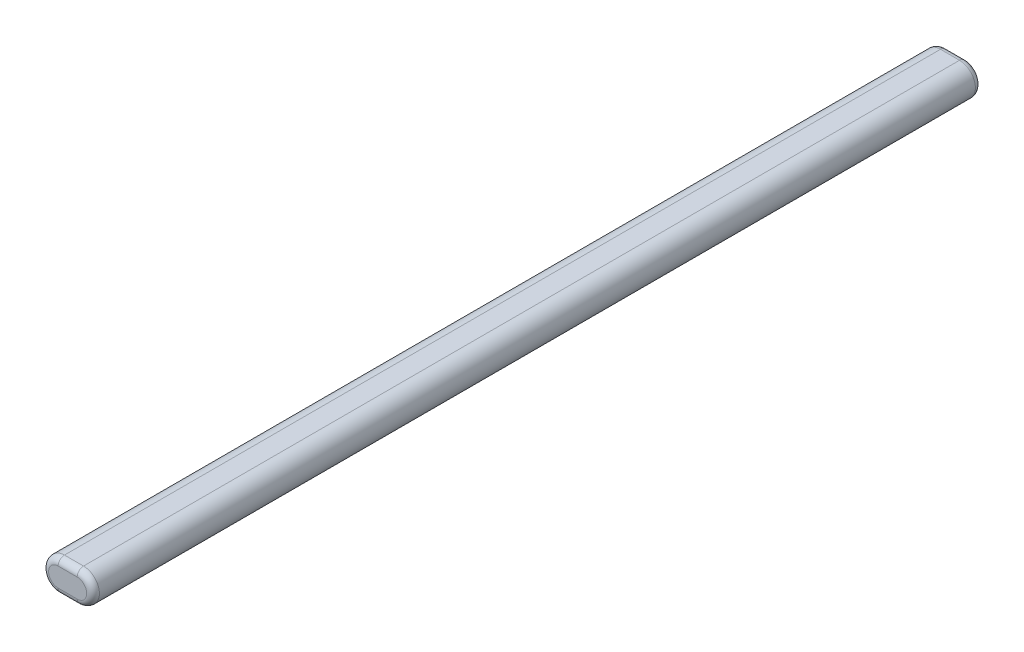
ISO-10303-21;
HEADER;
FILE_DESCRIPTION(('STEP AP214'),'2;1');
FILE_NAME('part.step','',(''),(''),'','','');
FILE_SCHEMA(('AUTOMOTIVE_DESIGN { 1 0 10303 214 1 1 1 1 }'));
ENDSEC;
DATA;
#1=APPLICATION_CONTEXT('core data for automotive mechanical design processes');
#2=APPLICATION_PROTOCOL_DEFINITION('international standard','automotive_design',2000,#1);
#3=PRODUCT_CONTEXT('',#1,'mechanical');
#4=PRODUCT('Part','Part','',(#3));
#5=PRODUCT_RELATED_PRODUCT_CATEGORY('part','',(#4));
#6=PRODUCT_DEFINITION_FORMATION('','',#4);
#7=PRODUCT_DEFINITION_CONTEXT('part definition',#1,'design');
#8=PRODUCT_DEFINITION('design','',#6,#7);
#9=PRODUCT_DEFINITION_SHAPE('','',#8);
#10=(LENGTH_UNIT() NAMED_UNIT(*) SI_UNIT(.MILLI.,.METRE.));
#11=(NAMED_UNIT(*) PLANE_ANGLE_UNIT() SI_UNIT($,.RADIAN.));
#12=(NAMED_UNIT(*) SI_UNIT($,.STERADIAN.) SOLID_ANGLE_UNIT());
#13=UNCERTAINTY_MEASURE_WITH_UNIT(LENGTH_MEASURE(1.E-05),#10,'distance_accuracy_value','');
#14=(GEOMETRIC_REPRESENTATION_CONTEXT(3) GLOBAL_UNCERTAINTY_ASSIGNED_CONTEXT((#13)) GLOBAL_UNIT_ASSIGNED_CONTEXT((#10,
#11,#12)) REPRESENTATION_CONTEXT('',''));
#15=CARTESIAN_POINT('',(0.,0.,0.));
#16=DIRECTION('',(0.,0.,1.));
#17=DIRECTION('',(1.,0.,0.));
#18=AXIS2_PLACEMENT_3D('',#15,#16,#17);
#19=CARTESIAN_POINT('',(-7.5,0.,700.));
#20=DIRECTION('',(0.,0.,-1.));
#21=DIRECTION('',(-1.,0.,0.));
#22=AXIS2_PLACEMENT_3D('',#19,#20,#21);
#23=CYLINDRICAL_SURFACE('',#22,12.5);
#24=DIRECTION('',(0.,0.,-1.));
#25=VECTOR('',#24,1.);
#26=CARTESIAN_POINT('',(-7.5,12.5,700.));
#27=LINE('',#26,#25);
#28=CARTESIAN_POINT('',(-7.5,12.5,695.));
#29=VERTEX_POINT('',#28);
#30=CARTESIAN_POINT('',(-7.5,12.5,5.));
#31=VERTEX_POINT('',#30);
#32=EDGE_CURVE('E155',#29,#31,#27,.T.);
#33=ORIENTED_EDGE('',*,*,#32,.T.);
#34=CARTESIAN_POINT('',(-7.5,0.,5.));
#35=DIRECTION('',(0.,0.,1.));
#36=DIRECTION('',(1.,0.,0.));
#37=AXIS2_PLACEMENT_3D('',#34,#35,#36);
#38=CIRCLE('',#37,12.5);
#39=CARTESIAN_POINT('',(-7.5,-12.5,5.));
#40=VERTEX_POINT('',#39);
#41=EDGE_CURVE('E179',#31,#40,#38,.T.);
#42=ORIENTED_EDGE('',*,*,#41,.T.);
#43=DIRECTION('',(0.,0.,-1.));
#44=VECTOR('',#43,1.);
#45=CARTESIAN_POINT('',(-7.5,-12.5,700.));
#46=LINE('',#45,#44);
#47=CARTESIAN_POINT('',(-7.5,-12.5,695.));
#48=VERTEX_POINT('',#47);
#49=EDGE_CURVE('E121',#48,#40,#46,.T.);
#50=ORIENTED_EDGE('',*,*,#49,.F.);
#51=CARTESIAN_POINT('',(-7.5,0.,695.));
#52=DIRECTION('',(0.,0.,1.));
#53=DIRECTION('',(1.,0.,0.));
#54=AXIS2_PLACEMENT_3D('',#51,#52,#53);
#55=CIRCLE('',#54,12.5);
#56=EDGE_CURVE('E177',#48,#29,#55,.F.);
#57=ORIENTED_EDGE('',*,*,#56,.T.);
#58=EDGE_LOOP('',(#33,#42,#50,#57));
#59=FACE_BOUND('',#58,.T.);
#60=ADVANCED_FACE('F33',(#59),#23,.T.);
#61=CARTESIAN_POINT('',(-7.5,-12.5,700.));
#62=DIRECTION('',(0.,1.,0.));
#63=DIRECTION('',(-1.,0.,0.));
#64=AXIS2_PLACEMENT_3D('',#61,#62,#63);
#65=PLANE('',#64);
#66=ORIENTED_EDGE('',*,*,#49,.T.);
#67=DIRECTION('',(1.,0.,0.));
#68=VECTOR('',#67,1.);
#69=CARTESIAN_POINT('',(-7.5,-12.5,5.));
#70=LINE('',#69,#68);
#71=CARTESIAN_POINT('',(7.49999999999999,-12.5,5.));
#72=VERTEX_POINT('',#71);
#73=EDGE_CURVE('E120',#40,#72,#70,.T.);
#74=ORIENTED_EDGE('',*,*,#73,.T.);
#75=DIRECTION('',(0.,0.,-1.));
#76=VECTOR('',#75,1.);
#77=CARTESIAN_POINT('',(7.49999999999999,-12.5,700.));
#78=LINE('',#77,#76);
#79=CARTESIAN_POINT('',(7.49999999999999,-12.5,695.));
#80=VERTEX_POINT('',#79);
#81=EDGE_CURVE('E102',#80,#72,#78,.T.);
#82=ORIENTED_EDGE('',*,*,#81,.F.);
#83=DIRECTION('',(1.,0.,0.));
#84=VECTOR('',#83,1.);
#85=CARTESIAN_POINT('',(-7.5,-12.5,695.));
#86=LINE('',#85,#84);
#87=EDGE_CURVE('E117',#80,#48,#86,.F.);
#88=ORIENTED_EDGE('',*,*,#87,.T.);
#89=EDGE_LOOP('',(#66,#74,#82,#88));
#90=FACE_BOUND('',#89,.T.);
#91=ADVANCED_FACE('F116',(#90),#65,.F.);
#92=CARTESIAN_POINT('',(7.5,0.,700.));
#93=DIRECTION('',(0.,0.,-1.));
#94=DIRECTION('',(-1.,0.,0.));
#95=AXIS2_PLACEMENT_3D('',#92,#93,#94);
#96=CYLINDRICAL_SURFACE('',#95,12.5);
#97=ORIENTED_EDGE('',*,*,#81,.T.);
#98=CARTESIAN_POINT('',(7.5,0.,5.));
#99=DIRECTION('',(0.,0.,1.));
#100=DIRECTION('',(1.,0.,0.));
#101=AXIS2_PLACEMENT_3D('',#98,#99,#100);
#102=CIRCLE('',#101,12.5);
#103=CARTESIAN_POINT('',(7.49999999999999,12.5,5.));
#104=VERTEX_POINT('',#103);
#105=EDGE_CURVE('E11',#72,#104,#102,.T.);
#106=ORIENTED_EDGE('',*,*,#105,.T.);
#107=DIRECTION('',(0.,0.,-1.));
#108=VECTOR('',#107,1.);
#109=CARTESIAN_POINT('',(7.49999999999999,12.5,700.));
#110=LINE('',#109,#108);
#111=CARTESIAN_POINT('',(7.49999999999999,12.5,695.));
#112=VERTEX_POINT('',#111);
#113=EDGE_CURVE('E104',#112,#104,#110,.T.);
#114=ORIENTED_EDGE('',*,*,#113,.F.);
#115=CARTESIAN_POINT('',(7.5,0.,695.));
#116=DIRECTION('',(0.,0.,1.));
#117=DIRECTION('',(1.,0.,0.));
#118=AXIS2_PLACEMENT_3D('',#115,#116,#117);
#119=CIRCLE('',#118,12.5);
#120=EDGE_CURVE('E42',#112,#80,#119,.F.);
#121=ORIENTED_EDGE('',*,*,#120,.T.);
#122=EDGE_LOOP('',(#97,#106,#114,#121));
#123=FACE_BOUND('',#122,.T.);
#124=ADVANCED_FACE('F101',(#123),#96,.T.);
#125=CARTESIAN_POINT('',(-7.5,12.5,700.));
#126=DIRECTION('',(0.,-1.,0.));
#127=DIRECTION('',(1.,0.,0.));
#128=AXIS2_PLACEMENT_3D('',#125,#126,#127);
#129=PLANE('',#128);
#130=ORIENTED_EDGE('',*,*,#113,.T.);
#131=DIRECTION('',(-1.,0.,0.));
#132=VECTOR('',#131,1.);
#133=CARTESIAN_POINT('',(-7.5,12.5,5.));
#134=LINE('',#133,#132);
#135=EDGE_CURVE('E183',#104,#31,#134,.T.);
#136=ORIENTED_EDGE('',*,*,#135,.T.);
#137=ORIENTED_EDGE('',*,*,#32,.F.);
#138=DIRECTION('',(-1.,0.,0.));
#139=VECTOR('',#138,1.);
#140=CARTESIAN_POINT('',(7.49999999999999,12.5,695.));
#141=LINE('',#140,#139);
#142=EDGE_CURVE('E181',#29,#112,#141,.F.);
#143=ORIENTED_EDGE('',*,*,#142,.T.);
#144=EDGE_LOOP('',(#130,#136,#137,#143));
#145=FACE_BOUND('',#144,.T.);
#146=ADVANCED_FACE('F193',(#145),#129,.F.);
#147=CARTESIAN_POINT('',(-7.5,0.,700.));
#148=DIRECTION('',(0.,0.,1.));
#149=DIRECTION('',(1.,0.,0.));
#150=AXIS2_PLACEMENT_3D('',#147,#148,#149);
#151=PLANE('',#150);
#152=CARTESIAN_POINT('',(-7.5,0.,700.));
#153=DIRECTION('',(0.,0.,1.));
#154=DIRECTION('',(1.,0.,0.));
#155=AXIS2_PLACEMENT_3D('',#152,#153,#154);
#156=CIRCLE('',#155,7.5);
#157=CARTESIAN_POINT('',(-7.5,7.5,700.));
#158=VERTEX_POINT('',#157);
#159=CARTESIAN_POINT('',(-7.5,-7.5,700.));
#160=VERTEX_POINT('',#159);
#161=EDGE_CURVE('E50',#158,#160,#156,.T.);
#162=ORIENTED_EDGE('',*,*,#161,.T.);
#163=DIRECTION('',(1.,0.,0.));
#164=VECTOR('',#163,1.);
#165=CARTESIAN_POINT('',(7.49999999999999,-7.5,700.));
#166=LINE('',#165,#164);
#167=CARTESIAN_POINT('',(7.49999999999999,-7.5,700.));
#168=VERTEX_POINT('',#167);
#169=EDGE_CURVE('E109',#160,#168,#166,.T.);
#170=ORIENTED_EDGE('',*,*,#169,.T.);
#171=CARTESIAN_POINT('',(7.5,0.,700.));
#172=DIRECTION('',(0.,0.,1.));
#173=DIRECTION('',(1.,0.,0.));
#174=AXIS2_PLACEMENT_3D('',#171,#172,#173);
#175=CIRCLE('',#174,7.5);
#176=CARTESIAN_POINT('',(7.49999999999999,7.5,700.));
#177=VERTEX_POINT('',#176);
#178=EDGE_CURVE('E132',#168,#177,#175,.T.);
#179=ORIENTED_EDGE('',*,*,#178,.T.);
#180=DIRECTION('',(-1.,0.,0.));
#181=VECTOR('',#180,1.);
#182=CARTESIAN_POINT('',(-7.5,7.5,700.));
#183=LINE('',#182,#181);
#184=EDGE_CURVE('E55',#177,#158,#183,.T.);
#185=ORIENTED_EDGE('',*,*,#184,.T.);
#186=EDGE_LOOP('',(#162,#170,#179,#185));
#187=FACE_BOUND('',#186,.T.);
#188=ADVANCED_FACE('F188',(#187),#151,.T.);
#189=CARTESIAN_POINT('',(-7.5,0.,0.));
#190=DIRECTION('',(0.,0.,1.));
#191=DIRECTION('',(1.,0.,0.));
#192=AXIS2_PLACEMENT_3D('',#189,#190,#191);
#193=PLANE('',#192);
#194=CARTESIAN_POINT('',(7.5,0.,0.));
#195=DIRECTION('',(0.,0.,1.));
#196=DIRECTION('',(1.,0.,0.));
#197=AXIS2_PLACEMENT_3D('',#194,#195,#196);
#198=CIRCLE('',#197,7.5);
#199=CARTESIAN_POINT('',(7.49999999999999,7.5,0.));
#200=VERTEX_POINT('',#199);
#201=CARTESIAN_POINT('',(7.49999999999999,-7.5,0.));
#202=VERTEX_POINT('',#201);
#203=EDGE_CURVE('E168',#200,#202,#198,.F.);
#204=ORIENTED_EDGE('',*,*,#203,.T.);
#205=DIRECTION('',(1.,0.,0.));
#206=VECTOR('',#205,1.);
#207=CARTESIAN_POINT('',(-7.49999999999999,-7.5,0.));
#208=LINE('',#207,#206);
#209=CARTESIAN_POINT('',(-7.5,-7.5,0.));
#210=VERTEX_POINT('',#209);
#211=EDGE_CURVE('E174',#202,#210,#208,.F.);
#212=ORIENTED_EDGE('',*,*,#211,.T.);
#213=CARTESIAN_POINT('',(-7.5,0.,0.));
#214=DIRECTION('',(0.,0.,1.));
#215=DIRECTION('',(1.,0.,0.));
#216=AXIS2_PLACEMENT_3D('',#213,#214,#215);
#217=CIRCLE('',#216,7.5);
#218=CARTESIAN_POINT('',(-7.5,7.5,0.));
#219=VERTEX_POINT('',#218);
#220=EDGE_CURVE('E172',#210,#219,#217,.F.);
#221=ORIENTED_EDGE('',*,*,#220,.T.);
#222=DIRECTION('',(-1.,0.,0.));
#223=VECTOR('',#222,1.);
#224=CARTESIAN_POINT('',(-7.5,7.5,0.));
#225=LINE('',#224,#223);
#226=EDGE_CURVE('E170',#219,#200,#225,.F.);
#227=ORIENTED_EDGE('',*,*,#226,.T.);
#228=EDGE_LOOP('',(#204,#212,#221,#227));
#229=FACE_BOUND('',#228,.T.);
#230=ADVANCED_FACE('F220',(#229),#193,.F.);
#231=CARTESIAN_POINT('',(-7.5,7.5,5.));
#232=DIRECTION('',(-1.,0.,0.));
#233=DIRECTION('',(0.,-1.,0.));
#234=AXIS2_PLACEMENT_3D('',#231,#232,#233);
#235=CYLINDRICAL_SURFACE('',#234,5.);
#236=CARTESIAN_POINT('',(7.49999999999999,7.5,5.));
#237=DIRECTION('',(1.,0.,0.));
#238=DIRECTION('',(0.,1.,0.));
#239=AXIS2_PLACEMENT_3D('',#236,#237,#238);
#240=CIRCLE('',#239,5.);
#241=EDGE_CURVE('E148',#200,#104,#240,.T.);
#242=ORIENTED_EDGE('',*,*,#241,.F.);
#243=ORIENTED_EDGE('',*,*,#226,.F.);
#244=CARTESIAN_POINT('',(-7.5,7.5,5.));
#245=DIRECTION('',(-1.,0.,0.));
#246=DIRECTION('',(0.,-1.,0.));
#247=AXIS2_PLACEMENT_3D('',#244,#245,#246);
#248=CIRCLE('',#247,5.);
#249=EDGE_CURVE('E137',#31,#219,#248,.T.);
#250=ORIENTED_EDGE('',*,*,#249,.F.);
#251=ORIENTED_EDGE('',*,*,#135,.F.);
#252=EDGE_LOOP('',(#242,#243,#250,#251));
#253=FACE_BOUND('',#252,.T.);
#254=ADVANCED_FACE('F196',(#253),#235,.T.);
#255=CARTESIAN_POINT('',(-7.5,0.,5.));
#256=DIRECTION('',(0.,0.,1.));
#257=DIRECTION('',(1.,0.,0.));
#258=AXIS2_PLACEMENT_3D('',#255,#256,#257);
#259=TOROIDAL_SURFACE('',#258,7.5,5.);
#260=ORIENTED_EDGE('',*,*,#249,.T.);
#261=ORIENTED_EDGE('',*,*,#220,.F.);
#262=CARTESIAN_POINT('',(-7.5,-7.5,5.));
#263=DIRECTION('',(1.,0.,0.));
#264=DIRECTION('',(0.,0.,-1.));
#265=AXIS2_PLACEMENT_3D('',#262,#263,#264);
#266=CIRCLE('',#265,5.);
#267=EDGE_CURVE('E142',#40,#210,#266,.T.);
#268=ORIENTED_EDGE('',*,*,#267,.F.);
#269=ORIENTED_EDGE('',*,*,#41,.F.);
#270=EDGE_LOOP('',(#260,#261,#268,#269));
#271=FACE_BOUND('',#270,.T.);
#272=ADVANCED_FACE('F199',(#271),#259,.T.);
#273=CARTESIAN_POINT('',(7.5,0.,5.));
#274=DIRECTION('',(0.,0.,1.));
#275=DIRECTION('',(1.,0.,0.));
#276=AXIS2_PLACEMENT_3D('',#273,#274,#275);
#277=TOROIDAL_SURFACE('',#276,7.5,5.);
#278=ORIENTED_EDGE('',*,*,#241,.T.);
#279=ORIENTED_EDGE('',*,*,#105,.F.);
#280=CARTESIAN_POINT('',(7.49999999999999,-7.5,5.));
#281=DIRECTION('',(-1.,0.,0.));
#282=DIRECTION('',(0.,-1.,0.));
#283=AXIS2_PLACEMENT_3D('',#280,#281,#282);
#284=CIRCLE('',#283,5.);
#285=EDGE_CURVE('E140',#202,#72,#284,.T.);
#286=ORIENTED_EDGE('',*,*,#285,.F.);
#287=ORIENTED_EDGE('',*,*,#203,.F.);
#288=EDGE_LOOP('',(#278,#279,#286,#287));
#289=FACE_BOUND('',#288,.T.);
#290=ADVANCED_FACE('F202',(#289),#277,.T.);
#291=CARTESIAN_POINT('',(-7.5,-7.5,5.));
#292=DIRECTION('',(1.,0.,0.));
#293=DIRECTION('',(0.,1.,0.));
#294=AXIS2_PLACEMENT_3D('',#291,#292,#293);
#295=CYLINDRICAL_SURFACE('',#294,5.);
#296=ORIENTED_EDGE('',*,*,#267,.T.);
#297=ORIENTED_EDGE('',*,*,#211,.F.);
#298=ORIENTED_EDGE('',*,*,#285,.T.);
#299=ORIENTED_EDGE('',*,*,#73,.F.);
#300=EDGE_LOOP('',(#296,#297,#298,#299));
#301=FACE_BOUND('',#300,.T.);
#302=ADVANCED_FACE('F200',(#301),#295,.T.);
#303=CARTESIAN_POINT('',(-7.5,7.5,695.));
#304=DIRECTION('',(1.,0.,0.));
#305=DIRECTION('',(0.,1.,0.));
#306=AXIS2_PLACEMENT_3D('',#303,#304,#305);
#307=CYLINDRICAL_SURFACE('',#306,5.);
#308=CARTESIAN_POINT('',(7.49999999999999,7.5,695.));
#309=DIRECTION('',(1.,0.,0.));
#310=DIRECTION('',(0.,1.,0.));
#311=AXIS2_PLACEMENT_3D('',#308,#309,#310);
#312=CIRCLE('',#311,5.);
#313=EDGE_CURVE('E134',#112,#177,#312,.T.);
#314=ORIENTED_EDGE('',*,*,#313,.F.);
#315=ORIENTED_EDGE('',*,*,#142,.F.);
#316=CARTESIAN_POINT('',(-7.5,7.5,695.));
#317=DIRECTION('',(-1.,0.,0.));
#318=DIRECTION('',(0.,0.,1.));
#319=AXIS2_PLACEMENT_3D('',#316,#317,#318);
#320=CIRCLE('',#319,5.);
#321=EDGE_CURVE('E37',#158,#29,#320,.T.);
#322=ORIENTED_EDGE('',*,*,#321,.F.);
#323=ORIENTED_EDGE('',*,*,#184,.F.);
#324=EDGE_LOOP('',(#314,#315,#322,#323));
#325=FACE_BOUND('',#324,.T.);
#326=ADVANCED_FACE('F35',(#325),#307,.T.);
#327=CARTESIAN_POINT('',(-7.5,0.,695.));
#328=DIRECTION('',(0.,0.,1.));
#329=DIRECTION('',(1.,0.,0.));
#330=AXIS2_PLACEMENT_3D('',#327,#328,#329);
#331=TOROIDAL_SURFACE('',#330,7.5,5.);
#332=ORIENTED_EDGE('',*,*,#321,.T.);
#333=ORIENTED_EDGE('',*,*,#56,.F.);
#334=CARTESIAN_POINT('',(-7.5,-7.5,695.));
#335=DIRECTION('',(1.,0.,0.));
#336=DIRECTION('',(0.,1.,0.));
#337=AXIS2_PLACEMENT_3D('',#334,#335,#336);
#338=CIRCLE('',#337,5.);
#339=EDGE_CURVE('E128',#160,#48,#338,.T.);
#340=ORIENTED_EDGE('',*,*,#339,.F.);
#341=ORIENTED_EDGE('',*,*,#161,.F.);
#342=EDGE_LOOP('',(#332,#333,#340,#341));
#343=FACE_BOUND('',#342,.T.);
#344=ADVANCED_FACE('F191',(#343),#331,.T.);
#345=CARTESIAN_POINT('',(7.5,0.,695.));
#346=DIRECTION('',(0.,0.,1.));
#347=DIRECTION('',(1.,0.,0.));
#348=AXIS2_PLACEMENT_3D('',#345,#346,#347);
#349=TOROIDAL_SURFACE('',#348,7.5,5.);
#350=ORIENTED_EDGE('',*,*,#313,.T.);
#351=ORIENTED_EDGE('',*,*,#178,.F.);
#352=CARTESIAN_POINT('',(7.49999999999999,-7.5,695.));
#353=DIRECTION('',(-1.,0.,0.));
#354=DIRECTION('',(0.,0.,1.));
#355=AXIS2_PLACEMENT_3D('',#352,#353,#354);
#356=CIRCLE('',#355,5.);
#357=EDGE_CURVE('E126',#80,#168,#356,.T.);
#358=ORIENTED_EDGE('',*,*,#357,.F.);
#359=ORIENTED_EDGE('',*,*,#120,.F.);
#360=EDGE_LOOP('',(#350,#351,#358,#359));
#361=FACE_BOUND('',#360,.T.);
#362=ADVANCED_FACE('F131',(#361),#349,.T.);
#363=CARTESIAN_POINT('',(-7.49999999999999,-7.5,695.));
#364=DIRECTION('',(-1.,0.,0.));
#365=DIRECTION('',(0.,-1.,0.));
#366=AXIS2_PLACEMENT_3D('',#363,#364,#365);
#367=CYLINDRICAL_SURFACE('',#366,5.);
#368=ORIENTED_EDGE('',*,*,#339,.T.);
#369=ORIENTED_EDGE('',*,*,#87,.F.);
#370=ORIENTED_EDGE('',*,*,#357,.T.);
#371=ORIENTED_EDGE('',*,*,#169,.F.);
#372=EDGE_LOOP('',(#368,#369,#370,#371));
#373=FACE_BOUND('',#372,.T.);
#374=ADVANCED_FACE('F124',(#373),#367,.T.);
#375=CLOSED_SHELL('',(#60,#91,#124,#146,#188,#230,#254,#272,#290,#302,#326,#344,#362,#374));
#376=MANIFOLD_SOLID_BREP('B2',#375);
#377=ADVANCED_BREP_SHAPE_REPRESENTATION('',(#18,#376),#14);
#378=SHAPE_DEFINITION_REPRESENTATION(#9,#377);
ENDSEC;
END-ISO-10303-21;
